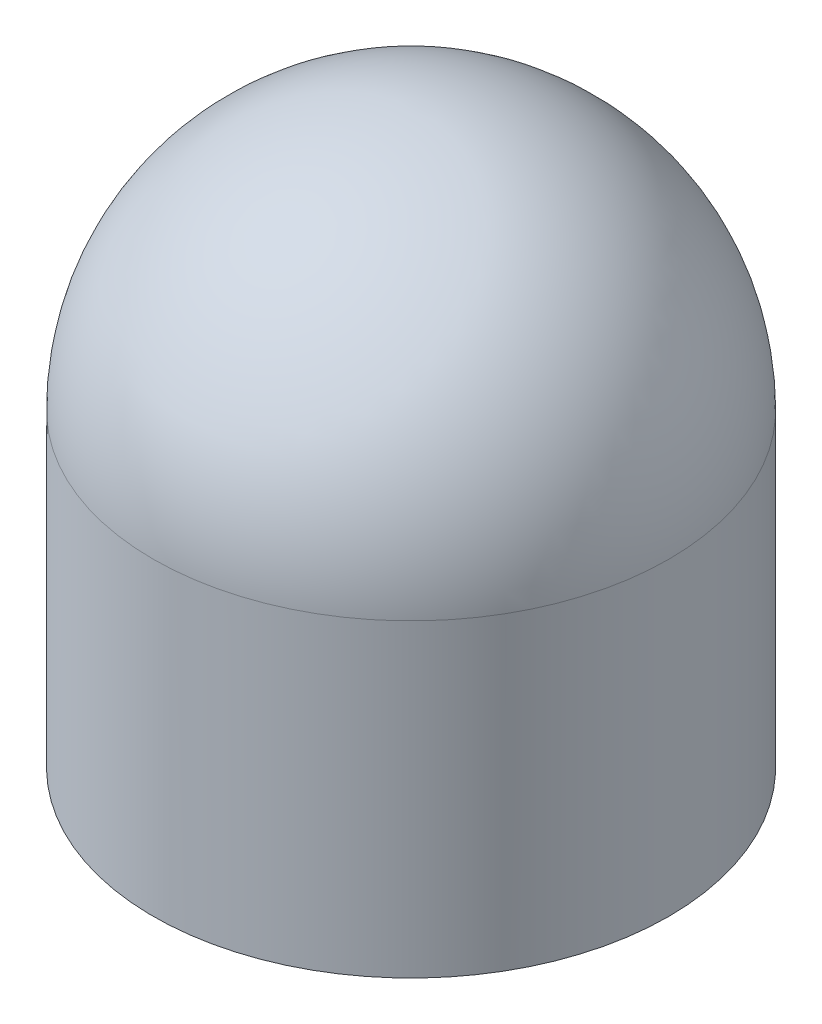
ISO-10303-21;
HEADER;
FILE_DESCRIPTION(('STEP AP214'),'2;1');
FILE_NAME('part.step','',(''),(''),'','','');
FILE_SCHEMA(('AUTOMOTIVE_DESIGN { 1 0 10303 214 1 1 1 1 }'));
ENDSEC;
DATA;
#1=APPLICATION_CONTEXT('core data for automotive mechanical design processes');
#2=APPLICATION_PROTOCOL_DEFINITION('international standard','automotive_design',2000,#1);
#3=PRODUCT_CONTEXT('',#1,'mechanical');
#4=PRODUCT('Part','Part','',(#3));
#5=PRODUCT_RELATED_PRODUCT_CATEGORY('part','',(#4));
#6=PRODUCT_DEFINITION_FORMATION('','',#4);
#7=PRODUCT_DEFINITION_CONTEXT('part definition',#1,'design');
#8=PRODUCT_DEFINITION('design','',#6,#7);
#9=PRODUCT_DEFINITION_SHAPE('','',#8);
#10=(LENGTH_UNIT() NAMED_UNIT(*) SI_UNIT(.MILLI.,.METRE.));
#11=(NAMED_UNIT(*) PLANE_ANGLE_UNIT() SI_UNIT($,.RADIAN.));
#12=(NAMED_UNIT(*) SI_UNIT($,.STERADIAN.) SOLID_ANGLE_UNIT());
#13=UNCERTAINTY_MEASURE_WITH_UNIT(LENGTH_MEASURE(1.E-05),#10,'distance_accuracy_value','');
#14=(GEOMETRIC_REPRESENTATION_CONTEXT(3) GLOBAL_UNCERTAINTY_ASSIGNED_CONTEXT((#13)) GLOBAL_UNIT_ASSIGNED_CONTEXT((#10,
#11,#12)) REPRESENTATION_CONTEXT('',''));
#15=CARTESIAN_POINT('',(0.,0.,0.));
#16=DIRECTION('',(0.,0.,1.));
#17=DIRECTION('',(1.,0.,0.));
#18=AXIS2_PLACEMENT_3D('',#15,#16,#17);
#19=CARTESIAN_POINT('',(0.,0.,0.));
#20=DIRECTION('',(0.,-1.,0.));
#21=DIRECTION('',(1.,0.,0.));
#22=AXIS2_PLACEMENT_3D('',#19,#20,#21);
#23=SPHERICAL_SURFACE('',#22,5.);
#24=CARTESIAN_POINT('',(0.,0.,0.));
#25=DIRECTION('',(0.,-1.,0.));
#26=DIRECTION('',(0.,0.,-1.));
#27=AXIS2_PLACEMENT_3D('',#24,#25,#26);
#28=CIRCLE('',#27,5.);
#29=CARTESIAN_POINT('',(0.,0.,-5.));
#30=VERTEX_POINT('',#29);
#31=EDGE_CURVE('E10',#30,#30,#28,.T.);
#32=ORIENTED_EDGE('',*,*,#31,.F.);
#33=EDGE_LOOP('',(#32));
#34=FACE_BOUND('',#33,.T.);
#35=ADVANCED_FACE('F38',(#34),#23,.T.);
#36=CARTESIAN_POINT('',(0.,-6.,0.));
#37=DIRECTION('',(0.,-1.,0.));
#38=DIRECTION('',(1.,0.,0.));
#39=AXIS2_PLACEMENT_3D('',#36,#37,#38);
#40=CYLINDRICAL_SURFACE('',#39,5.);
#41=ORIENTED_EDGE('',*,*,#31,.T.);
#42=EDGE_LOOP('',(#41));
#43=FACE_BOUND('',#42,.T.);
#44=CARTESIAN_POINT('',(0.,-6.,0.));
#45=DIRECTION('',(0.,-1.,0.));
#46=DIRECTION('',(1.,0.,0.));
#47=AXIS2_PLACEMENT_3D('',#44,#45,#46);
#48=CIRCLE('',#47,5.);
#49=CARTESIAN_POINT('',(5.,-6.,0.));
#50=VERTEX_POINT('',#49);
#51=EDGE_CURVE('E49',#50,#50,#48,.T.);
#52=ORIENTED_EDGE('',*,*,#51,.F.);
#53=EDGE_LOOP('',(#52));
#54=FACE_BOUND('',#53,.T.);
#55=ADVANCED_FACE('F58',(#43,#54),#40,.T.);
#56=CARTESIAN_POINT('',(5.,-6.,0.));
#57=DIRECTION('',(0.,-1.,0.));
#58=DIRECTION('',(1.,0.,0.));
#59=AXIS2_PLACEMENT_3D('',#56,#57,#58);
#60=PLANE('',#59);
#61=ORIENTED_EDGE('',*,*,#51,.T.);
#62=EDGE_LOOP('',(#61));
#63=FACE_BOUND('',#62,.T.);
#64=ADVANCED_FACE('F56',(#63),#60,.T.);
#65=CLOSED_SHELL('',(#35,#55,#64));
#66=CARTESIAN_POINT('',(0.,0.,0.));
#67=DIRECTION('',(0.,-1.,0.));
#68=DIRECTION('',(1.,0.,0.));
#69=AXIS2_PLACEMENT_3D('',#66,#67,#68);
#70=SPHERICAL_SURFACE('',#69,4.9);
#71=CARTESIAN_POINT('',(0.,0.,0.));
#72=DIRECTION('',(0.,1.,0.));
#73=DIRECTION('',(-1.,0.,0.));
#74=AXIS2_PLACEMENT_3D('',#71,#72,#73);
#75=CIRCLE('',#74,4.9);
#76=CARTESIAN_POINT('',(-4.9,0.,0.));
#77=VERTEX_POINT('',#76);
#78=EDGE_CURVE('E45',#77,#77,#75,.F.);
#79=ORIENTED_EDGE('',*,*,#78,.T.);
#80=EDGE_LOOP('',(#79));
#81=FACE_BOUND('',#80,.T.);
#82=ADVANCED_FACE('F70',(#81),#70,.F.);
#83=CARTESIAN_POINT('',(0.,0.,0.));
#84=DIRECTION('',(0.,1.,0.));
#85=DIRECTION('',(-1.,0.,0.));
#86=AXIS2_PLACEMENT_3D('',#83,#84,#85);
#87=PLANE('',#86);
#88=ORIENTED_EDGE('',*,*,#78,.F.);
#89=EDGE_LOOP('',(#88));
#90=FACE_BOUND('',#89,.T.);
#91=ADVANCED_FACE('F68',(#90),#87,.T.);
#92=CLOSED_SHELL('',(#82,#91));
#93=ORIENTED_CLOSED_SHELL('',*,#92,.T.);
#94=BREP_WITH_VOIDS('B2',#65,(#93));
#95=ADVANCED_BREP_SHAPE_REPRESENTATION('',(#18,#94),#14);
#96=SHAPE_DEFINITION_REPRESENTATION(#9,#95);
ENDSEC;
END-ISO-10303-21;
